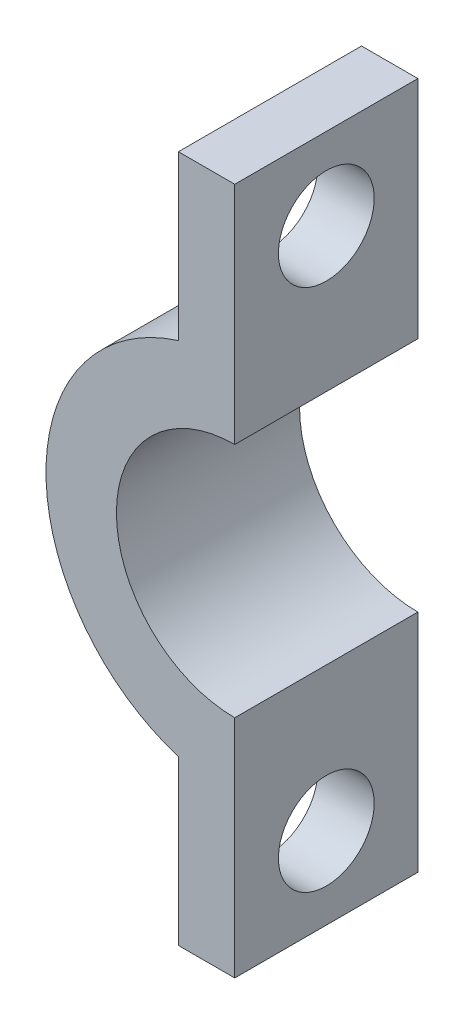
ISO-10303-21;
HEADER;
FILE_DESCRIPTION(('STEP AP214'),'2;1');
FILE_NAME('part.step','',(''),(''),'','','');
FILE_SCHEMA(('AUTOMOTIVE_DESIGN { 1 0 10303 214 1 1 1 1 }'));
ENDSEC;
DATA;
#1=APPLICATION_CONTEXT('core data for automotive mechanical design processes');
#2=APPLICATION_PROTOCOL_DEFINITION('international standard','automotive_design',2000,#1);
#3=PRODUCT_CONTEXT('',#1,'mechanical');
#4=PRODUCT('Part','Part','',(#3));
#5=PRODUCT_RELATED_PRODUCT_CATEGORY('part','',(#4));
#6=PRODUCT_DEFINITION_FORMATION('','',#4);
#7=PRODUCT_DEFINITION_CONTEXT('part definition',#1,'design');
#8=PRODUCT_DEFINITION('design','',#6,#7);
#9=PRODUCT_DEFINITION_SHAPE('','',#8);
#10=(LENGTH_UNIT() NAMED_UNIT(*) SI_UNIT(.MILLI.,.METRE.));
#11=(NAMED_UNIT(*) PLANE_ANGLE_UNIT() SI_UNIT($,.RADIAN.));
#12=(NAMED_UNIT(*) SI_UNIT($,.STERADIAN.) SOLID_ANGLE_UNIT());
#13=UNCERTAINTY_MEASURE_WITH_UNIT(LENGTH_MEASURE(1.E-05),#10,'distance_accuracy_value','');
#14=(GEOMETRIC_REPRESENTATION_CONTEXT(3) GLOBAL_UNCERTAINTY_ASSIGNED_CONTEXT((#13)) GLOBAL_UNIT_ASSIGNED_CONTEXT((#10,
#11,#12)) REPRESENTATION_CONTEXT('',''));
#15=CARTESIAN_POINT('',(0.,0.,0.));
#16=DIRECTION('',(0.,0.,1.));
#17=DIRECTION('',(1.,0.,0.));
#18=AXIS2_PLACEMENT_3D('',#15,#16,#17);
#19=CARTESIAN_POINT('',(0.,0.,6.5));
#20=DIRECTION('',(0.,0.,-1.));
#21=DIRECTION('',(-1.,0.,0.));
#22=AXIS2_PLACEMENT_3D('',#19,#20,#21);
#23=CYLINDRICAL_SURFACE('',#22,4.2);
#24=CARTESIAN_POINT('',(0.,0.,0.));
#25=DIRECTION('',(0.,0.,-1.));
#26=DIRECTION('',(1.,0.,0.));
#27=AXIS2_PLACEMENT_3D('',#24,#25,#26);
#28=CIRCLE('',#27,4.2);
#29=CARTESIAN_POINT('',(0.,-4.2,0.));
#30=VERTEX_POINT('',#29);
#31=CARTESIAN_POINT('',(0.,4.2,0.));
#32=VERTEX_POINT('',#31);
#33=EDGE_CURVE('E130',#30,#32,#28,.T.);
#34=ORIENTED_EDGE('',*,*,#33,.T.);
#35=DIRECTION('',(0.,0.,-1.));
#36=VECTOR('',#35,1.);
#37=CARTESIAN_POINT('',(0.,4.2,6.5));
#38=LINE('',#37,#36);
#39=CARTESIAN_POINT('',(0.,4.2,6.5));
#40=VERTEX_POINT('',#39);
#41=EDGE_CURVE('E11',#40,#32,#38,.T.);
#42=ORIENTED_EDGE('',*,*,#41,.F.);
#43=CARTESIAN_POINT('',(0.,0.,6.5));
#44=DIRECTION('',(0.,0.,-1.));
#45=DIRECTION('',(1.,0.,0.));
#46=AXIS2_PLACEMENT_3D('',#43,#44,#45);
#47=CIRCLE('',#46,4.2);
#48=CARTESIAN_POINT('',(0.,-4.2,6.5));
#49=VERTEX_POINT('',#48);
#50=EDGE_CURVE('E145',#49,#40,#47,.T.);
#51=ORIENTED_EDGE('',*,*,#50,.F.);
#52=DIRECTION('',(0.,0.,-1.));
#53=VECTOR('',#52,1.);
#54=CARTESIAN_POINT('',(0.,-4.2,6.5));
#55=LINE('',#54,#53);
#56=EDGE_CURVE('E126',#49,#30,#55,.T.);
#57=ORIENTED_EDGE('',*,*,#56,.T.);
#58=EDGE_LOOP('',(#34,#42,#51,#57));
#59=FACE_BOUND('',#58,.T.);
#60=ADVANCED_FACE('F33',(#59),#23,.F.);
#61=CARTESIAN_POINT('',(0.,4.2,6.5));
#62=DIRECTION('',(-1.,0.,0.));
#63=DIRECTION('',(0.,0.,1.));
#64=AXIS2_PLACEMENT_3D('',#61,#62,#63);
#65=PLANE('',#64);
#66=CARTESIAN_POINT('',(0.,9.29726445574964,3.25));
#67=DIRECTION('',(-1.,0.,0.));
#68=DIRECTION('',(0.,0.,1.));
#69=AXIS2_PLACEMENT_3D('',#66,#67,#68);
#70=CIRCLE('',#69,1.7);
#71=CARTESIAN_POINT('',(0.,7.59726445574963,3.25));
#72=VERTEX_POINT('',#71);
#73=EDGE_CURVE('E134',#72,#72,#70,.T.);
#74=ORIENTED_EDGE('',*,*,#73,.T.);
#75=EDGE_LOOP('',(#74));
#76=FACE_BOUND('',#75,.T.);
#77=DIRECTION('',(0.,1.,0.));
#78=VECTOR('',#77,1.);
#79=CARTESIAN_POINT('',(0.,4.2,0.));
#80=LINE('',#79,#78);
#81=CARTESIAN_POINT('',(0.,12.2,0.));
#82=VERTEX_POINT('',#81);
#83=EDGE_CURVE('E133',#32,#82,#80,.T.);
#84=ORIENTED_EDGE('',*,*,#83,.T.);
#85=DIRECTION('',(0.,0.,-1.));
#86=VECTOR('',#85,1.);
#87=CARTESIAN_POINT('',(0.,12.2,6.5));
#88=LINE('',#87,#86);
#89=CARTESIAN_POINT('',(0.,12.2,6.5));
#90=VERTEX_POINT('',#89);
#91=EDGE_CURVE('E42',#90,#82,#88,.T.);
#92=ORIENTED_EDGE('',*,*,#91,.F.);
#93=DIRECTION('',(0.,1.,0.));
#94=VECTOR('',#93,1.);
#95=CARTESIAN_POINT('',(0.,4.2,6.5));
#96=LINE('',#95,#94);
#97=EDGE_CURVE('E93',#40,#90,#96,.T.);
#98=ORIENTED_EDGE('',*,*,#97,.F.);
#99=ORIENTED_EDGE('',*,*,#41,.T.);
#100=EDGE_LOOP('',(#84,#92,#98,#99));
#101=FACE_BOUND('',#100,.T.);
#102=ADVANCED_FACE('F204',(#76,#101),#65,.F.);
#103=CARTESIAN_POINT('',(0.,12.2,6.5));
#104=DIRECTION('',(0.,-1.,0.));
#105=DIRECTION('',(0.,0.,-1.));
#106=AXIS2_PLACEMENT_3D('',#103,#104,#105);
#107=PLANE('',#106);
#108=DIRECTION('',(-1.,0.,0.));
#109=VECTOR('',#108,1.);
#110=CARTESIAN_POINT('',(0.,12.2,0.));
#111=LINE('',#110,#109);
#112=CARTESIAN_POINT('',(-2.,12.2,0.));
#113=VERTEX_POINT('',#112);
#114=EDGE_CURVE('E136',#82,#113,#111,.T.);
#115=ORIENTED_EDGE('',*,*,#114,.T.);
#116=DIRECTION('',(0.,0.,-1.));
#117=VECTOR('',#116,1.);
#118=CARTESIAN_POINT('',(-2.,12.2,6.5));
#119=LINE('',#118,#117);
#120=CARTESIAN_POINT('',(-2.,12.2,6.5));
#121=VERTEX_POINT('',#120);
#122=EDGE_CURVE('E152',#121,#113,#119,.T.);
#123=ORIENTED_EDGE('',*,*,#122,.F.);
#124=DIRECTION('',(-1.,0.,0.));
#125=VECTOR('',#124,1.);
#126=CARTESIAN_POINT('',(0.,12.2,6.5));
#127=LINE('',#126,#125);
#128=EDGE_CURVE('E161',#90,#121,#127,.T.);
#129=ORIENTED_EDGE('',*,*,#128,.F.);
#130=ORIENTED_EDGE('',*,*,#91,.T.);
#131=EDGE_LOOP('',(#115,#123,#129,#130));
#132=FACE_BOUND('',#131,.T.);
#133=ADVANCED_FACE('F159',(#132),#107,.F.);
#134=CARTESIAN_POINT('',(-2.,12.2,6.5));
#135=DIRECTION('',(1.,0.,0.));
#136=DIRECTION('',(0.,1.,0.));
#137=AXIS2_PLACEMENT_3D('',#134,#135,#136);
#138=PLANE('',#137);
#139=CARTESIAN_POINT('',(-2.,9.29726445574963,3.25));
#140=DIRECTION('',(-1.,0.,0.));
#141=DIRECTION('',(0.,-1.,0.));
#142=AXIS2_PLACEMENT_3D('',#139,#140,#141);
#143=CIRCLE('',#142,1.7);
#144=CARTESIAN_POINT('',(-2.,7.59726445574963,3.25));
#145=VERTEX_POINT('',#144);
#146=EDGE_CURVE('E181',#145,#145,#143,.T.);
#147=ORIENTED_EDGE('',*,*,#146,.F.);
#148=EDGE_LOOP('',(#147));
#149=FACE_BOUND('',#148,.T.);
#150=DIRECTION('',(0.,-1.,0.));
#151=VECTOR('',#150,1.);
#152=CARTESIAN_POINT('',(-2.,12.2,0.));
#153=LINE('',#152,#151);
#154=CARTESIAN_POINT('',(-2.,6.39452891149927,0.));
#155=VERTEX_POINT('',#154);
#156=EDGE_CURVE('E138',#113,#155,#153,.T.);
#157=ORIENTED_EDGE('',*,*,#156,.T.);
#158=DIRECTION('',(0.,0.,-1.));
#159=VECTOR('',#158,1.);
#160=CARTESIAN_POINT('',(-2.,6.39452891149927,6.5));
#161=LINE('',#160,#159);
#162=CARTESIAN_POINT('',(-2.,6.39452891149927,6.5));
#163=VERTEX_POINT('',#162);
#164=EDGE_CURVE('E149',#163,#155,#161,.T.);
#165=ORIENTED_EDGE('',*,*,#164,.F.);
#166=DIRECTION('',(0.,-1.,0.));
#167=VECTOR('',#166,1.);
#168=CARTESIAN_POINT('',(-2.,12.2,6.5));
#169=LINE('',#168,#167);
#170=EDGE_CURVE('E173',#121,#163,#169,.T.);
#171=ORIENTED_EDGE('',*,*,#170,.F.);
#172=ORIENTED_EDGE('',*,*,#122,.T.);
#173=EDGE_LOOP('',(#157,#165,#171,#172));
#174=FACE_BOUND('',#173,.T.);
#175=ADVANCED_FACE('F169',(#149,#174),#138,.F.);
#176=CARTESIAN_POINT('',(0.,0.,6.5));
#177=DIRECTION('',(0.,0.,-1.));
#178=DIRECTION('',(-1.,0.,0.));
#179=AXIS2_PLACEMENT_3D('',#176,#177,#178);
#180=CYLINDRICAL_SURFACE('',#179,6.7);
#181=CARTESIAN_POINT('',(0.,0.,0.));
#182=DIRECTION('',(0.,0.,1.));
#183=DIRECTION('',(1.,0.,0.));
#184=AXIS2_PLACEMENT_3D('',#181,#182,#183);
#185=CIRCLE('',#184,6.7);
#186=CARTESIAN_POINT('',(-2.,-6.39452891149927,0.));
#187=VERTEX_POINT('',#186);
#188=EDGE_CURVE('E140',#155,#187,#185,.T.);
#189=ORIENTED_EDGE('',*,*,#188,.T.);
#190=DIRECTION('',(0.,0.,-1.));
#191=VECTOR('',#190,1.);
#192=CARTESIAN_POINT('',(-2.,-6.39452891149927,6.5));
#193=LINE('',#192,#191);
#194=CARTESIAN_POINT('',(-2.,-6.39452891149927,6.5));
#195=VERTEX_POINT('',#194);
#196=EDGE_CURVE('E121',#195,#187,#193,.T.);
#197=ORIENTED_EDGE('',*,*,#196,.F.);
#198=CARTESIAN_POINT('',(0.,0.,6.5));
#199=DIRECTION('',(0.,0.,1.));
#200=DIRECTION('',(1.,0.,0.));
#201=AXIS2_PLACEMENT_3D('',#198,#199,#200);
#202=CIRCLE('',#201,6.7);
#203=EDGE_CURVE('E112',#163,#195,#202,.T.);
#204=ORIENTED_EDGE('',*,*,#203,.F.);
#205=ORIENTED_EDGE('',*,*,#164,.T.);
#206=EDGE_LOOP('',(#189,#197,#204,#205));
#207=FACE_BOUND('',#206,.T.);
#208=ADVANCED_FACE('F172',(#207),#180,.T.);
#209=CARTESIAN_POINT('',(-2.,-12.2,6.5));
#210=DIRECTION('',(1.,0.,0.));
#211=DIRECTION('',(0.,1.,0.));
#212=AXIS2_PLACEMENT_3D('',#209,#210,#211);
#213=PLANE('',#212);
#214=CARTESIAN_POINT('',(-2.,-9.29726445574963,3.25));
#215=DIRECTION('',(1.,0.,0.));
#216=DIRECTION('',(0.,1.,0.));
#217=AXIS2_PLACEMENT_3D('',#214,#215,#216);
#218=CIRCLE('',#217,1.7);
#219=CARTESIAN_POINT('',(-2.,-10.9972644557496,3.25));
#220=VERTEX_POINT('',#219);
#221=EDGE_CURVE('E184',#220,#220,#218,.T.);
#222=ORIENTED_EDGE('',*,*,#221,.T.);
#223=EDGE_LOOP('',(#222));
#224=FACE_BOUND('',#223,.T.);
#225=DIRECTION('',(0.,-1.,0.));
#226=VECTOR('',#225,1.);
#227=CARTESIAN_POINT('',(-2.,-12.2,0.));
#228=LINE('',#227,#226);
#229=CARTESIAN_POINT('',(-2.,-12.2,0.));
#230=VERTEX_POINT('',#229);
#231=EDGE_CURVE('E120',#187,#230,#228,.T.);
#232=ORIENTED_EDGE('',*,*,#231,.T.);
#233=DIRECTION('',(0.,0.,-1.));
#234=VECTOR('',#233,1.);
#235=CARTESIAN_POINT('',(-2.,-12.2,6.5));
#236=LINE('',#235,#234);
#237=CARTESIAN_POINT('',(-2.,-12.2,6.5));
#238=VERTEX_POINT('',#237);
#239=EDGE_CURVE('E117',#238,#230,#236,.T.);
#240=ORIENTED_EDGE('',*,*,#239,.F.);
#241=DIRECTION('',(0.,-1.,0.));
#242=VECTOR('',#241,1.);
#243=CARTESIAN_POINT('',(-2.,-12.2,6.5));
#244=LINE('',#243,#242);
#245=EDGE_CURVE('E106',#195,#238,#244,.T.);
#246=ORIENTED_EDGE('',*,*,#245,.F.);
#247=ORIENTED_EDGE('',*,*,#196,.T.);
#248=EDGE_LOOP('',(#232,#240,#246,#247));
#249=FACE_BOUND('',#248,.T.);
#250=ADVANCED_FACE('F118',(#224,#249),#213,.F.);
#251=CARTESIAN_POINT('',(0.,-12.2,6.5));
#252=DIRECTION('',(0.,1.,0.));
#253=DIRECTION('',(0.,0.,1.));
#254=AXIS2_PLACEMENT_3D('',#251,#252,#253);
#255=PLANE('',#254);
#256=DIRECTION('',(1.,0.,0.));
#257=VECTOR('',#256,1.);
#258=CARTESIAN_POINT('',(0.,-12.2,0.));
#259=LINE('',#258,#257);
#260=CARTESIAN_POINT('',(0.,-12.2,0.));
#261=VERTEX_POINT('',#260);
#262=EDGE_CURVE('E79',#230,#261,#259,.T.);
#263=ORIENTED_EDGE('',*,*,#262,.T.);
#264=DIRECTION('',(0.,0.,-1.));
#265=VECTOR('',#264,1.);
#266=CARTESIAN_POINT('',(0.,-12.2,6.5));
#267=LINE('',#266,#265);
#268=CARTESIAN_POINT('',(0.,-12.2,6.5));
#269=VERTEX_POINT('',#268);
#270=EDGE_CURVE('E122',#269,#261,#267,.T.);
#271=ORIENTED_EDGE('',*,*,#270,.F.);
#272=DIRECTION('',(1.,0.,0.));
#273=VECTOR('',#272,1.);
#274=CARTESIAN_POINT('',(0.,-12.2,6.5));
#275=LINE('',#274,#273);
#276=EDGE_CURVE('E110',#238,#269,#275,.T.);
#277=ORIENTED_EDGE('',*,*,#276,.F.);
#278=ORIENTED_EDGE('',*,*,#239,.T.);
#279=EDGE_LOOP('',(#263,#271,#277,#278));
#280=FACE_BOUND('',#279,.T.);
#281=ADVANCED_FACE('F124',(#280),#255,.F.);
#282=CARTESIAN_POINT('',(0.,-4.2,6.5));
#283=DIRECTION('',(-1.,0.,0.));
#284=DIRECTION('',(0.,0.,1.));
#285=AXIS2_PLACEMENT_3D('',#282,#283,#284);
#286=PLANE('',#285);
#287=CARTESIAN_POINT('',(0.,-9.29726445574964,3.25));
#288=DIRECTION('',(-1.,0.,0.));
#289=DIRECTION('',(0.,0.,1.));
#290=AXIS2_PLACEMENT_3D('',#287,#288,#289);
#291=CIRCLE('',#290,1.7);
#292=CARTESIAN_POINT('',(0.,-10.9972644557496,3.25));
#293=VERTEX_POINT('',#292);
#294=EDGE_CURVE('E36',#293,#293,#291,.F.);
#295=ORIENTED_EDGE('',*,*,#294,.F.);
#296=EDGE_LOOP('',(#295));
#297=FACE_BOUND('',#296,.T.);
#298=DIRECTION('',(0.,1.,0.));
#299=VECTOR('',#298,1.);
#300=CARTESIAN_POINT('',(0.,-4.2,0.));
#301=LINE('',#300,#299);
#302=EDGE_CURVE('E85',#261,#30,#301,.T.);
#303=ORIENTED_EDGE('',*,*,#302,.T.);
#304=ORIENTED_EDGE('',*,*,#56,.F.);
#305=DIRECTION('',(0.,1.,0.));
#306=VECTOR('',#305,1.);
#307=CARTESIAN_POINT('',(0.,-4.2,6.5));
#308=LINE('',#307,#306);
#309=EDGE_CURVE('E50',#269,#49,#308,.T.);
#310=ORIENTED_EDGE('',*,*,#309,.F.);
#311=ORIENTED_EDGE('',*,*,#270,.T.);
#312=EDGE_LOOP('',(#303,#304,#310,#311));
#313=FACE_BOUND('',#312,.T.);
#314=ADVANCED_FACE('F193',(#297,#313),#286,.F.);
#315=CARTESIAN_POINT('',(0.,0.,6.5));
#316=DIRECTION('',(0.,0.,1.));
#317=DIRECTION('',(1.,0.,0.));
#318=AXIS2_PLACEMENT_3D('',#315,#316,#317);
#319=PLANE('',#318);
#320=ORIENTED_EDGE('',*,*,#50,.T.);
#321=ORIENTED_EDGE('',*,*,#97,.T.);
#322=ORIENTED_EDGE('',*,*,#128,.T.);
#323=ORIENTED_EDGE('',*,*,#170,.T.);
#324=ORIENTED_EDGE('',*,*,#203,.T.);
#325=ORIENTED_EDGE('',*,*,#245,.T.);
#326=ORIENTED_EDGE('',*,*,#276,.T.);
#327=ORIENTED_EDGE('',*,*,#309,.T.);
#328=EDGE_LOOP('',(#320,#321,#322,#323,#324,#325,#326,#327));
#329=FACE_BOUND('',#328,.T.);
#330=ADVANCED_FACE('F108',(#329),#319,.T.);
#331=CARTESIAN_POINT('',(0.,0.,0.));
#332=DIRECTION('',(0.,0.,1.));
#333=DIRECTION('',(1.,0.,0.));
#334=AXIS2_PLACEMENT_3D('',#331,#332,#333);
#335=PLANE('',#334);
#336=ORIENTED_EDGE('',*,*,#33,.F.);
#337=ORIENTED_EDGE('',*,*,#302,.F.);
#338=ORIENTED_EDGE('',*,*,#262,.F.);
#339=ORIENTED_EDGE('',*,*,#231,.F.);
#340=ORIENTED_EDGE('',*,*,#188,.F.);
#341=ORIENTED_EDGE('',*,*,#156,.F.);
#342=ORIENTED_EDGE('',*,*,#114,.F.);
#343=ORIENTED_EDGE('',*,*,#83,.F.);
#344=EDGE_LOOP('',(#336,#337,#338,#339,#340,#341,#342,#343));
#345=FACE_BOUND('',#344,.T.);
#346=ADVANCED_FACE('F165',(#345),#335,.F.);
#347=CARTESIAN_POINT('',(4.5,9.29726445574964,3.25));
#348=DIRECTION('',(-1.,0.,0.));
#349=DIRECTION('',(0.,-1.,0.));
#350=AXIS2_PLACEMENT_3D('',#347,#348,#349);
#351=CYLINDRICAL_SURFACE('',#350,1.7);
#352=CARTESIAN_POINT('',(-2.,7.59726445574963,3.25));
#353=CARTESIAN_POINT('',(-1.97916666666667,7.59726445574963,3.25));
#354=CARTESIAN_POINT('',(-1.95833333333333,7.59726445574963,3.25));
#355=CARTESIAN_POINT('',(-1.91666666666667,7.59726445574963,3.25));
#356=CARTESIAN_POINT('',(-1.89583333333333,7.59726445574963,3.25));
#357=CARTESIAN_POINT('',(-1.85416666666667,7.59726445574963,3.25));
#358=CARTESIAN_POINT('',(-1.83333333333333,7.59726445574963,3.25));
#359=CARTESIAN_POINT('',(-1.79166666666667,7.59726445574963,3.25));
#360=CARTESIAN_POINT('',(-1.77083333333333,7.59726445574963,3.25));
#361=CARTESIAN_POINT('',(-1.72916666666667,7.59726445574963,3.25));
#362=CARTESIAN_POINT('',(-1.70833333333333,7.59726445574963,3.25));
#363=CARTESIAN_POINT('',(-1.66666666666667,7.59726445574963,3.25));
#364=CARTESIAN_POINT('',(-1.64583333333333,7.59726445574963,3.25));
#365=CARTESIAN_POINT('',(-1.60416666666667,7.59726445574963,3.25));
#366=CARTESIAN_POINT('',(-1.58333333333333,7.59726445574963,3.25));
#367=CARTESIAN_POINT('',(-1.54166666666667,7.59726445574963,3.25));
#368=CARTESIAN_POINT('',(-1.52083333333333,7.59726445574963,3.25));
#369=CARTESIAN_POINT('',(-1.47916666666667,7.59726445574963,3.25));
#370=CARTESIAN_POINT('',(-1.45833333333333,7.59726445574963,3.25));
#371=CARTESIAN_POINT('',(-1.41666666666667,7.59726445574963,3.25));
#372=CARTESIAN_POINT('',(-1.39583333333333,7.59726445574963,3.25));
#373=CARTESIAN_POINT('',(-1.35416666666667,7.59726445574963,3.25));
#374=CARTESIAN_POINT('',(-1.33333333333333,7.59726445574963,3.25));
#375=CARTESIAN_POINT('',(-1.29166666666667,7.59726445574963,3.25));
#376=CARTESIAN_POINT('',(-1.27083333333333,7.59726445574963,3.25));
#377=CARTESIAN_POINT('',(-1.22916666666667,7.59726445574963,3.25));
#378=CARTESIAN_POINT('',(-1.20833333333333,7.59726445574963,3.25));
#379=CARTESIAN_POINT('',(-1.16666666666667,7.59726445574963,3.25));
#380=CARTESIAN_POINT('',(-1.14583333333333,7.59726445574963,3.25));
#381=CARTESIAN_POINT('',(-1.10416666666667,7.59726445574963,3.25));
#382=CARTESIAN_POINT('',(-1.08333333333333,7.59726445574963,3.25));
#383=CARTESIAN_POINT('',(-1.04166666666667,7.59726445574963,3.25));
#384=CARTESIAN_POINT('',(-1.02083333333333,7.59726445574963,3.25));
#385=CARTESIAN_POINT('',(-0.979166666666666,7.59726445574963,3.25));
#386=CARTESIAN_POINT('',(-0.958333333333332,7.59726445574963,3.25));
#387=CARTESIAN_POINT('',(-0.916666666666666,7.59726445574963,3.25));
#388=CARTESIAN_POINT('',(-0.895833333333332,7.59726445574963,3.25));
#389=CARTESIAN_POINT('',(-0.854166666666666,7.59726445574963,3.25));
#390=CARTESIAN_POINT('',(-0.833333333333332,7.59726445574963,3.25));
#391=CARTESIAN_POINT('',(-0.791666666666666,7.59726445574963,3.25));
#392=CARTESIAN_POINT('',(-0.770833333333332,7.59726445574963,3.25));
#393=CARTESIAN_POINT('',(-0.729166666666666,7.59726445574963,3.25));
#394=CARTESIAN_POINT('',(-0.708333333333332,7.59726445574963,3.25));
#395=CARTESIAN_POINT('',(-0.666666666666666,7.59726445574963,3.25));
#396=CARTESIAN_POINT('',(-0.645833333333332,7.59726445574963,3.25));
#397=CARTESIAN_POINT('',(-0.604166666666666,7.59726445574963,3.25));
#398=CARTESIAN_POINT('',(-0.583333333333332,7.59726445574963,3.25));
#399=CARTESIAN_POINT('',(-0.541666666666665,7.59726445574963,3.25));
#400=CARTESIAN_POINT('',(-0.520833333333332,7.59726445574963,3.25));
#401=CARTESIAN_POINT('',(-0.479166666666665,7.59726445574963,3.25));
#402=CARTESIAN_POINT('',(-0.458333333333332,7.59726445574963,3.25));
#403=CARTESIAN_POINT('',(-0.416666666666665,7.59726445574963,3.25));
#404=CARTESIAN_POINT('',(-0.395833333333332,7.59726445574963,3.25));
#405=CARTESIAN_POINT('',(-0.354166666666665,7.59726445574963,3.25));
#406=CARTESIAN_POINT('',(-0.333333333333332,7.59726445574963,3.25));
#407=CARTESIAN_POINT('',(-0.291666666666665,7.59726445574963,3.25));
#408=CARTESIAN_POINT('',(-0.270833333333332,7.59726445574963,3.25));
#409=CARTESIAN_POINT('',(-0.229166666666665,7.59726445574963,3.25));
#410=CARTESIAN_POINT('',(-0.208333333333332,7.59726445574963,3.25));
#411=CARTESIAN_POINT('',(-0.166666666666665,7.59726445574963,3.25));
#412=CARTESIAN_POINT('',(-0.145833333333332,7.59726445574963,3.25));
#413=CARTESIAN_POINT('',(-0.104166666666665,7.59726445574963,3.25));
#414=CARTESIAN_POINT('',(-0.0833333333333317,7.59726445574963,3.25));
#415=CARTESIAN_POINT('',(-0.041666666666665,7.59726445574963,3.25));
#416=CARTESIAN_POINT('',(-0.0208333333333316,7.59726445574963,3.25));
#417=CARTESIAN_POINT('',(0.,7.59726445574963,3.25));
#418=B_SPLINE_CURVE_WITH_KNOTS('',3,(#352,#353,#354,#355,#356,#357,#358,#359,#360,#361,#362,
#363,#364,#365,#366,#367,#368,#369,#370,#371,#372,#373,#374,#375,#376,#377,#378,#379,#380,#381,
#382,#383,#384,#385,#386,#387,#388,#389,#390,#391,#392,#393,#394,#395,#396,#397,#398,#399,#400,
#401,#402,#403,#404,#405,#406,#407,#408,#409,#410,#411,#412,#413,#414,#415,#416,#417),
.UNSPECIFIED.,.F.,.F.,(4,2,2,2,2,2,2,2,2,2,2,2,2,2,2,2,2,2,2,2,2,2,2,2,2,2,2,2,2,2,2,2,4),(0.,
0.0625000000000001,0.125,0.1875,0.25,0.3125,0.375,0.4375,0.5,0.5625,0.625000000000001,
0.687500000000001,0.750000000000001,0.812500000000001,0.875000000000001,0.937500000000001,1.,
1.0625,1.125,1.1875,1.25,1.3125,1.375,1.4375,1.5,1.5625,1.625,1.6875,1.75,1.8125,1.875,1.9375,
2.),.UNSPECIFIED.);
#419=EDGE_CURVE('BSEAM250',#145,#72,#418,.T.);
#420=ORIENTED_EDGE('',*,*,#146,.T.);
#421=ORIENTED_EDGE('',*,*,#73,.F.);
#422=ORIENTED_EDGE('',*,*,#419,.T.);
#423=ORIENTED_EDGE('',*,*,#419,.F.);
#424=EDGE_LOOP('',(#420,#422,#421,#423));
#425=FACE_BOUND('',#424,.T.);
#426=ADVANCED_FACE('F250',(#425),#351,.F.);
#427=CARTESIAN_POINT('',(4.5,-9.29726445574964,3.25));
#428=DIRECTION('',(-1.,0.,0.));
#429=DIRECTION('',(0.,-1.,0.));
#430=AXIS2_PLACEMENT_3D('',#427,#428,#429);
#431=CYLINDRICAL_SURFACE('',#430,1.7);
#432=CARTESIAN_POINT('',(-2.,-10.9972644557496,3.25));
#433=CARTESIAN_POINT('',(-1.97916666666667,-10.9972644557496,3.25));
#434=CARTESIAN_POINT('',(-1.95833333333333,-10.9972644557496,3.25));
#435=CARTESIAN_POINT('',(-1.91666666666667,-10.9972644557496,3.25));
#436=CARTESIAN_POINT('',(-1.89583333333333,-10.9972644557496,3.25));
#437=CARTESIAN_POINT('',(-1.85416666666667,-10.9972644557496,3.25));
#438=CARTESIAN_POINT('',(-1.83333333333333,-10.9972644557496,3.25));
#439=CARTESIAN_POINT('',(-1.79166666666667,-10.9972644557496,3.25));
#440=CARTESIAN_POINT('',(-1.77083333333333,-10.9972644557496,3.25));
#441=CARTESIAN_POINT('',(-1.72916666666667,-10.9972644557496,3.25));
#442=CARTESIAN_POINT('',(-1.70833333333333,-10.9972644557496,3.25));
#443=CARTESIAN_POINT('',(-1.66666666666667,-10.9972644557496,3.25));
#444=CARTESIAN_POINT('',(-1.64583333333333,-10.9972644557496,3.25));
#445=CARTESIAN_POINT('',(-1.60416666666667,-10.9972644557496,3.25));
#446=CARTESIAN_POINT('',(-1.58333333333333,-10.9972644557496,3.25));
#447=CARTESIAN_POINT('',(-1.54166666666667,-10.9972644557496,3.25));
#448=CARTESIAN_POINT('',(-1.52083333333333,-10.9972644557496,3.25));
#449=CARTESIAN_POINT('',(-1.47916666666667,-10.9972644557496,3.25));
#450=CARTESIAN_POINT('',(-1.45833333333333,-10.9972644557496,3.25));
#451=CARTESIAN_POINT('',(-1.41666666666667,-10.9972644557496,3.25));
#452=CARTESIAN_POINT('',(-1.39583333333333,-10.9972644557496,3.25));
#453=CARTESIAN_POINT('',(-1.35416666666667,-10.9972644557496,3.25));
#454=CARTESIAN_POINT('',(-1.33333333333333,-10.9972644557496,3.25));
#455=CARTESIAN_POINT('',(-1.29166666666667,-10.9972644557496,3.25));
#456=CARTESIAN_POINT('',(-1.27083333333333,-10.9972644557496,3.25));
#457=CARTESIAN_POINT('',(-1.22916666666667,-10.9972644557496,3.25));
#458=CARTESIAN_POINT('',(-1.20833333333333,-10.9972644557496,3.25));
#459=CARTESIAN_POINT('',(-1.16666666666667,-10.9972644557496,3.25));
#460=CARTESIAN_POINT('',(-1.14583333333333,-10.9972644557496,3.25));
#461=CARTESIAN_POINT('',(-1.10416666666667,-10.9972644557496,3.25));
#462=CARTESIAN_POINT('',(-1.08333333333333,-10.9972644557496,3.25));
#463=CARTESIAN_POINT('',(-1.04166666666667,-10.9972644557496,3.25));
#464=CARTESIAN_POINT('',(-1.02083333333333,-10.9972644557496,3.25));
#465=CARTESIAN_POINT('',(-0.979166666666666,-10.9972644557496,3.25));
#466=CARTESIAN_POINT('',(-0.958333333333332,-10.9972644557496,3.25));
#467=CARTESIAN_POINT('',(-0.916666666666666,-10.9972644557496,3.25));
#468=CARTESIAN_POINT('',(-0.895833333333332,-10.9972644557496,3.25));
#469=CARTESIAN_POINT('',(-0.854166666666666,-10.9972644557496,3.25));
#470=CARTESIAN_POINT('',(-0.833333333333332,-10.9972644557496,3.25));
#471=CARTESIAN_POINT('',(-0.791666666666666,-10.9972644557496,3.25));
#472=CARTESIAN_POINT('',(-0.770833333333332,-10.9972644557496,3.25));
#473=CARTESIAN_POINT('',(-0.729166666666666,-10.9972644557496,3.25));
#474=CARTESIAN_POINT('',(-0.708333333333332,-10.9972644557496,3.25));
#475=CARTESIAN_POINT('',(-0.666666666666666,-10.9972644557496,3.25));
#476=CARTESIAN_POINT('',(-0.645833333333332,-10.9972644557496,3.25));
#477=CARTESIAN_POINT('',(-0.604166666666666,-10.9972644557496,3.25));
#478=CARTESIAN_POINT('',(-0.583333333333332,-10.9972644557496,3.25));
#479=CARTESIAN_POINT('',(-0.541666666666665,-10.9972644557496,3.25));
#480=CARTESIAN_POINT('',(-0.520833333333332,-10.9972644557496,3.25));
#481=CARTESIAN_POINT('',(-0.479166666666665,-10.9972644557496,3.25));
#482=CARTESIAN_POINT('',(-0.458333333333332,-10.9972644557496,3.25));
#483=CARTESIAN_POINT('',(-0.416666666666665,-10.9972644557496,3.25));
#484=CARTESIAN_POINT('',(-0.395833333333332,-10.9972644557496,3.25));
#485=CARTESIAN_POINT('',(-0.354166666666665,-10.9972644557496,3.25));
#486=CARTESIAN_POINT('',(-0.333333333333332,-10.9972644557496,3.25));
#487=CARTESIAN_POINT('',(-0.291666666666665,-10.9972644557496,3.25));
#488=CARTESIAN_POINT('',(-0.270833333333332,-10.9972644557496,3.25));
#489=CARTESIAN_POINT('',(-0.229166666666665,-10.9972644557496,3.25));
#490=CARTESIAN_POINT('',(-0.208333333333332,-10.9972644557496,3.25));
#491=CARTESIAN_POINT('',(-0.166666666666665,-10.9972644557496,3.25));
#492=CARTESIAN_POINT('',(-0.145833333333332,-10.9972644557496,3.25));
#493=CARTESIAN_POINT('',(-0.104166666666665,-10.9972644557496,3.25));
#494=CARTESIAN_POINT('',(-0.0833333333333317,-10.9972644557496,3.25));
#495=CARTESIAN_POINT('',(-0.041666666666665,-10.9972644557496,3.25));
#496=CARTESIAN_POINT('',(-0.0208333333333316,-10.9972644557496,3.25));
#497=CARTESIAN_POINT('',(0.,-10.9972644557496,3.25));
#498=B_SPLINE_CURVE_WITH_KNOTS('',3,(#432,#433,#434,#435,#436,#437,#438,#439,#440,#441,#442,
#443,#444,#445,#446,#447,#448,#449,#450,#451,#452,#453,#454,#455,#456,#457,#458,#459,#460,#461,
#462,#463,#464,#465,#466,#467,#468,#469,#470,#471,#472,#473,#474,#475,#476,#477,#478,#479,#480,
#481,#482,#483,#484,#485,#486,#487,#488,#489,#490,#491,#492,#493,#494,#495,#496,#497),
.UNSPECIFIED.,.F.,.F.,(4,2,2,2,2,2,2,2,2,2,2,2,2,2,2,2,2,2,2,2,2,2,2,2,2,2,2,2,2,2,2,2,4),(0.,
0.0625000000000001,0.125,0.1875,0.25,0.3125,0.375,0.4375,0.5,0.5625,0.625000000000001,
0.687500000000001,0.750000000000001,0.812500000000001,0.875000000000001,0.937500000000001,1.,
1.0625,1.125,1.1875,1.25,1.3125,1.375,1.4375,1.5,1.5625,1.625,1.6875,1.75,1.8125,1.875,1.9375,
2.),.UNSPECIFIED.);
#499=EDGE_CURVE('BSEAM191',#220,#293,#498,.T.);
#500=ORIENTED_EDGE('',*,*,#221,.F.);
#501=ORIENTED_EDGE('',*,*,#294,.T.);
#502=ORIENTED_EDGE('',*,*,#499,.T.);
#503=ORIENTED_EDGE('',*,*,#499,.F.);
#504=EDGE_LOOP('',(#500,#502,#501,#503));
#505=FACE_BOUND('',#504,.T.);
#506=ADVANCED_FACE('F191',(#505),#431,.F.);
#507=CLOSED_SHELL('',(#60,#102,#133,#175,#208,#250,#281,#314,#330,#346,#426,#506));
#508=MANIFOLD_SOLID_BREP('B2',#507);
#509=ADVANCED_BREP_SHAPE_REPRESENTATION('',(#18,#508),#14);
#510=SHAPE_DEFINITION_REPRESENTATION(#9,#509);
ENDSEC;
END-ISO-10303-21;
